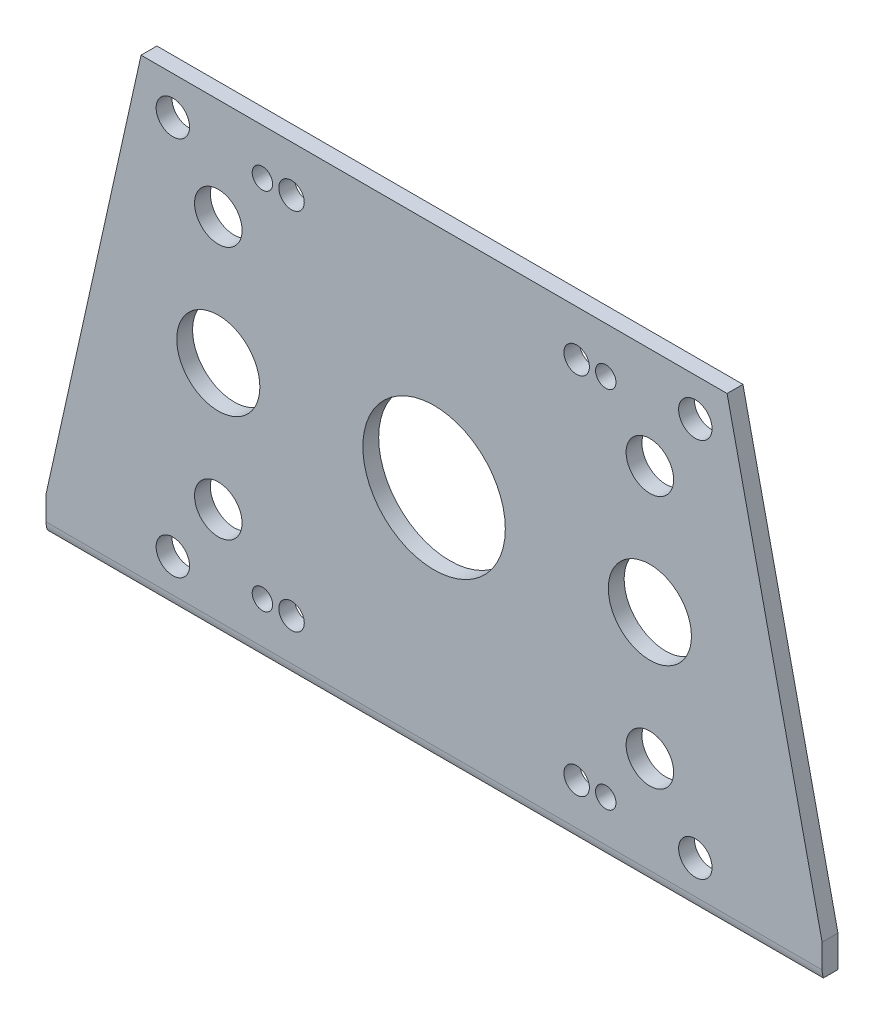
ISO-10303-21;
HEADER;
FILE_DESCRIPTION(('STEP AP214'),'2;1');
FILE_NAME('part.step','',(''),(''),'','','');
FILE_SCHEMA(('AUTOMOTIVE_DESIGN { 1 0 10303 214 1 1 1 1 }'));
ENDSEC;
DATA;
#1=APPLICATION_CONTEXT('core data for automotive mechanical design processes');
#2=APPLICATION_PROTOCOL_DEFINITION('international standard','automotive_design',2000,#1);
#3=PRODUCT_CONTEXT('',#1,'mechanical');
#4=PRODUCT('Part','Part','',(#3));
#5=PRODUCT_RELATED_PRODUCT_CATEGORY('part','',(#4));
#6=PRODUCT_DEFINITION_FORMATION('','',#4);
#7=PRODUCT_DEFINITION_CONTEXT('part definition',#1,'design');
#8=PRODUCT_DEFINITION('design','',#6,#7);
#9=PRODUCT_DEFINITION_SHAPE('','',#8);
#10=(LENGTH_UNIT() NAMED_UNIT(*) SI_UNIT(.MILLI.,.METRE.));
#11=(NAMED_UNIT(*) PLANE_ANGLE_UNIT() SI_UNIT($,.RADIAN.));
#12=(NAMED_UNIT(*) SI_UNIT($,.STERADIAN.) SOLID_ANGLE_UNIT());
#13=UNCERTAINTY_MEASURE_WITH_UNIT(LENGTH_MEASURE(1.E-05),#10,'distance_accuracy_value','');
#14=(GEOMETRIC_REPRESENTATION_CONTEXT(3) GLOBAL_UNCERTAINTY_ASSIGNED_CONTEXT((#13)) GLOBAL_UNIT_ASSIGNED_CONTEXT((#10,
#11,#12)) REPRESENTATION_CONTEXT('',''));
#15=CARTESIAN_POINT('',(0.,0.,0.));
#16=DIRECTION('',(0.,0.,1.));
#17=DIRECTION('',(1.,0.,0.));
#18=AXIS2_PLACEMENT_3D('',#15,#16,#17);
#19=CARTESIAN_POINT('',(-77.7875,46.0375,0.));
#20=DIRECTION('',(0.,0.,-1.));
#21=DIRECTION('',(-1.,0.,0.));
#22=AXIS2_PLACEMENT_3D('',#19,#20,#21);
#23=PLANE('',#22);
#24=CARTESIAN_POINT('',(52.3702628744709,38.4175,0.));
#25=DIRECTION('',(0.,0.,-1.));
#26=DIRECTION('',(-1.,0.,0.));
#27=AXIS2_PLACEMENT_3D('',#24,#25,#26);
#28=CIRCLE('',#27,3.35279999999999);
#29=CARTESIAN_POINT('',(49.0174628744709,38.4175,0.));
#30=VERTEX_POINT('',#29);
#31=EDGE_CURVE('E380',#30,#30,#28,.T.);
#32=ORIENTED_EDGE('',*,*,#31,.F.);
#33=EDGE_LOOP('',(#32));
#34=FACE_BOUND('',#33,.T.);
#35=CARTESIAN_POINT('',(52.3702628744709,-37.7825,0.));
#36=DIRECTION('',(0.,0.,-1.));
#37=DIRECTION('',(-1.,0.,0.));
#38=AXIS2_PLACEMENT_3D('',#35,#36,#37);
#39=CIRCLE('',#38,3.35279999999999);
#40=CARTESIAN_POINT('',(49.0174628744709,-37.7825,0.));
#41=VERTEX_POINT('',#40);
#42=EDGE_CURVE('E374',#41,#41,#39,.T.);
#43=ORIENTED_EDGE('',*,*,#42,.F.);
#44=EDGE_LOOP('',(#43));
#45=FACE_BOUND('',#44,.T.);
#46=CARTESIAN_POINT('',(0.,0.31749999999996,0.));
#47=DIRECTION('',(0.,0.,-1.));
#48=DIRECTION('',(-1.,0.,0.));
#49=AXIS2_PLACEMENT_3D('',#46,#47,#48);
#50=CIRCLE('',#49,14.28115);
#51=CARTESIAN_POINT('',(-14.28115,0.31749999999996,0.));
#52=VERTEX_POINT('',#51);
#53=EDGE_CURVE('E366',#52,#52,#50,.T.);
#54=ORIENTED_EDGE('',*,*,#53,.F.);
#55=EDGE_LOOP('',(#54));
#56=FACE_BOUND('',#55,.T.);
#57=CARTESIAN_POINT('',(34.417,-36.195,0.));
#58=DIRECTION('',(0.,0.,-1.));
#59=DIRECTION('',(-1.,0.,0.));
#60=AXIS2_PLACEMENT_3D('',#57,#58,#59);
#61=CIRCLE('',#60,2.04469999999999);
#62=CARTESIAN_POINT('',(32.3723,-36.195,0.));
#63=VERTEX_POINT('',#62);
#64=EDGE_CURVE('E358',#63,#63,#61,.T.);
#65=ORIENTED_EDGE('',*,*,#64,.F.);
#66=EDGE_LOOP('',(#65));
#67=FACE_BOUND('',#66,.T.);
#68=CARTESIAN_POINT('',(-34.417,36.8299999999999,0.));
#69=DIRECTION('',(0.,0.,-1.));
#70=DIRECTION('',(-1.,0.,0.));
#71=AXIS2_PLACEMENT_3D('',#68,#69,#70);
#72=CIRCLE('',#71,2.04469999999999);
#73=CARTESIAN_POINT('',(-36.4617,36.8299999999999,0.));
#74=VERTEX_POINT('',#73);
#75=EDGE_CURVE('E352',#74,#74,#72,.T.);
#76=ORIENTED_EDGE('',*,*,#75,.F.);
#77=EDGE_LOOP('',(#76));
#78=FACE_BOUND('',#77,.T.);
#79=CARTESIAN_POINT('',(-28.575,-36.195,0.));
#80=DIRECTION('',(0.,0.,-1.));
#81=DIRECTION('',(-1.,0.,0.));
#82=AXIS2_PLACEMENT_3D('',#79,#80,#81);
#83=CIRCLE('',#82,2.55270000000001);
#84=CARTESIAN_POINT('',(-31.1277,-36.195,0.));
#85=VERTEX_POINT('',#84);
#86=EDGE_CURVE('E344',#85,#85,#83,.T.);
#87=ORIENTED_EDGE('',*,*,#86,.F.);
#88=EDGE_LOOP('',(#87));
#89=FACE_BOUND('',#88,.T.);
#90=CARTESIAN_POINT('',(28.575,36.83,0.));
#91=DIRECTION('',(0.,0.,-1.));
#92=DIRECTION('',(-1.,0.,0.));
#93=AXIS2_PLACEMENT_3D('',#90,#91,#92);
#94=CIRCLE('',#93,2.55270000000001);
#95=CARTESIAN_POINT('',(26.0223,36.83,0.));
#96=VERTEX_POINT('',#95);
#97=EDGE_CURVE('E336',#96,#96,#94,.T.);
#98=ORIENTED_EDGE('',*,*,#97,.F.);
#99=EDGE_LOOP('',(#98));
#100=FACE_BOUND('',#99,.T.);
#101=CARTESIAN_POINT('',(43.2562,25.7175,0.));
#102=DIRECTION('',(0.,0.,-1.));
#103=DIRECTION('',(-1.,0.,0.));
#104=AXIS2_PLACEMENT_3D('',#101,#102,#103);
#105=CIRCLE('',#104,4.76249999999999);
#106=CARTESIAN_POINT('',(38.4937,25.7175,0.));
#107=VERTEX_POINT('',#106);
#108=EDGE_CURVE('E328',#107,#107,#105,.T.);
#109=ORIENTED_EDGE('',*,*,#108,.F.);
#110=EDGE_LOOP('',(#109));
#111=FACE_BOUND('',#110,.T.);
#112=CARTESIAN_POINT('',(43.2562,-25.0825,0.));
#113=DIRECTION('',(0.,0.,-1.));
#114=DIRECTION('',(-1.,0.,0.));
#115=AXIS2_PLACEMENT_3D('',#112,#113,#114);
#116=CIRCLE('',#115,4.76249999999999);
#117=CARTESIAN_POINT('',(38.4937,-25.0825,0.));
#118=VERTEX_POINT('',#117);
#119=EDGE_CURVE('E320',#118,#118,#116,.T.);
#120=ORIENTED_EDGE('',*,*,#119,.F.);
#121=EDGE_LOOP('',(#120));
#122=FACE_BOUND('',#121,.T.);
#123=CARTESIAN_POINT('',(-43.2562,25.7175,0.));
#124=DIRECTION('',(0.,0.,-1.));
#125=DIRECTION('',(-1.,0.,0.));
#126=AXIS2_PLACEMENT_3D('',#123,#124,#125);
#127=CIRCLE('',#126,4.76249999999999);
#128=CARTESIAN_POINT('',(-48.0187,25.7175,0.));
#129=VERTEX_POINT('',#128);
#130=EDGE_CURVE('E314',#129,#129,#127,.T.);
#131=ORIENTED_EDGE('',*,*,#130,.F.);
#132=EDGE_LOOP('',(#131));
#133=FACE_BOUND('',#132,.T.);
#134=CARTESIAN_POINT('',(-43.2562,0.317499999999954,0.));
#135=DIRECTION('',(0.,0.,-1.));
#136=DIRECTION('',(-1.,0.,0.));
#137=AXIS2_PLACEMENT_3D('',#134,#135,#136);
#138=CIRCLE('',#137,8.33119999999999);
#139=CARTESIAN_POINT('',(-51.5874,0.317499999999954,0.));
#140=VERTEX_POINT('',#139);
#141=EDGE_CURVE('E308',#140,#140,#138,.T.);
#142=ORIENTED_EDGE('',*,*,#141,.F.);
#143=EDGE_LOOP('',(#142));
#144=FACE_BOUND('',#143,.T.);
#145=CARTESIAN_POINT('',(-43.2562,-25.0825,0.));
#146=DIRECTION('',(0.,0.,-1.));
#147=DIRECTION('',(-1.,0.,0.));
#148=AXIS2_PLACEMENT_3D('',#145,#146,#147);
#149=CIRCLE('',#148,4.76249999999999);
#150=CARTESIAN_POINT('',(-48.0187,-25.0825,0.));
#151=VERTEX_POINT('',#150);
#152=EDGE_CURVE('E302',#151,#151,#149,.T.);
#153=ORIENTED_EDGE('',*,*,#152,.F.);
#154=EDGE_LOOP('',(#153));
#155=FACE_BOUND('',#154,.T.);
#156=CARTESIAN_POINT('',(43.2562,0.317499999999966,0.));
#157=DIRECTION('',(0.,0.,-1.));
#158=DIRECTION('',(-1.,0.,0.));
#159=AXIS2_PLACEMENT_3D('',#156,#157,#158);
#160=CIRCLE('',#159,8.33119999999999);
#161=CARTESIAN_POINT('',(34.925,0.317499999999966,0.));
#162=VERTEX_POINT('',#161);
#163=EDGE_CURVE('E294',#162,#162,#160,.T.);
#164=ORIENTED_EDGE('',*,*,#163,.F.);
#165=EDGE_LOOP('',(#164));
#166=FACE_BOUND('',#165,.T.);
#167=CARTESIAN_POINT('',(-28.575,36.83,0.));
#168=DIRECTION('',(0.,0.,-1.));
#169=DIRECTION('',(-1.,0.,0.));
#170=AXIS2_PLACEMENT_3D('',#167,#168,#169);
#171=CIRCLE('',#170,2.55270000000001);
#172=CARTESIAN_POINT('',(-31.1277,36.83,0.));
#173=VERTEX_POINT('',#172);
#174=EDGE_CURVE('E286',#173,#173,#171,.T.);
#175=ORIENTED_EDGE('',*,*,#174,.F.);
#176=EDGE_LOOP('',(#175));
#177=FACE_BOUND('',#176,.T.);
#178=CARTESIAN_POINT('',(28.575,-36.195,0.));
#179=DIRECTION('',(0.,0.,-1.));
#180=DIRECTION('',(-1.,0.,0.));
#181=AXIS2_PLACEMENT_3D('',#178,#179,#180);
#182=CIRCLE('',#181,2.55270000000001);
#183=CARTESIAN_POINT('',(26.0223,-36.195,0.));
#184=VERTEX_POINT('',#183);
#185=EDGE_CURVE('E278',#184,#184,#182,.T.);
#186=ORIENTED_EDGE('',*,*,#185,.F.);
#187=EDGE_LOOP('',(#186));
#188=FACE_BOUND('',#187,.T.);
#189=CARTESIAN_POINT('',(-34.417,-36.1950000000001,0.));
#190=DIRECTION('',(0.,0.,-1.));
#191=DIRECTION('',(-1.,0.,0.));
#192=AXIS2_PLACEMENT_3D('',#189,#190,#191);
#193=CIRCLE('',#192,2.04469999999999);
#194=CARTESIAN_POINT('',(-36.4617,-36.1950000000001,0.));
#195=VERTEX_POINT('',#194);
#196=EDGE_CURVE('E272',#195,#195,#193,.T.);
#197=ORIENTED_EDGE('',*,*,#196,.F.);
#198=EDGE_LOOP('',(#197));
#199=FACE_BOUND('',#198,.T.);
#200=CARTESIAN_POINT('',(34.417,36.83,0.));
#201=DIRECTION('',(0.,0.,-1.));
#202=DIRECTION('',(-1.,0.,0.));
#203=AXIS2_PLACEMENT_3D('',#200,#201,#202);
#204=CIRCLE('',#203,2.04469999999999);
#205=CARTESIAN_POINT('',(32.3723,36.83,0.));
#206=VERTEX_POINT('',#205);
#207=EDGE_CURVE('E264',#206,#206,#204,.T.);
#208=ORIENTED_EDGE('',*,*,#207,.F.);
#209=EDGE_LOOP('',(#208));
#210=FACE_BOUND('',#209,.T.);
#211=CARTESIAN_POINT('',(-52.3702628744709,38.4175,0.));
#212=DIRECTION('',(0.,0.,-1.));
#213=DIRECTION('',(-1.,0.,0.));
#214=AXIS2_PLACEMENT_3D('',#211,#212,#213);
#215=CIRCLE('',#214,3.35279999999999);
#216=CARTESIAN_POINT('',(-55.7230628744709,38.4175,0.));
#217=VERTEX_POINT('',#216);
#218=EDGE_CURVE('E258',#217,#217,#215,.T.);
#219=ORIENTED_EDGE('',*,*,#218,.F.);
#220=EDGE_LOOP('',(#219));
#221=FACE_BOUND('',#220,.T.);
#222=CARTESIAN_POINT('',(-52.3702628744709,-37.7825,0.));
#223=DIRECTION('',(0.,0.,-1.));
#224=DIRECTION('',(-1.,0.,0.));
#225=AXIS2_PLACEMENT_3D('',#222,#223,#224);
#226=CIRCLE('',#225,3.35279999999999);
#227=CARTESIAN_POINT('',(-55.7230628744709,-37.7825,0.));
#228=VERTEX_POINT('',#227);
#229=EDGE_CURVE('E129',#228,#228,#226,.T.);
#230=ORIENTED_EDGE('',*,*,#229,.F.);
#231=EDGE_LOOP('',(#230));
#232=FACE_BOUND('',#231,.T.);
#233=DIRECTION('',(0.,1.,0.));
#234=VECTOR('',#233,1.);
#235=CARTESIAN_POINT('',(77.7875,46.0375,0.));
#236=LINE('',#235,#234);
#237=CARTESIAN_POINT('',(77.7875,-46.0375,0.));
#238=VERTEX_POINT('',#237);
#239=CARTESIAN_POINT('',(77.7875,-39.6875,0.));
#240=VERTEX_POINT('',#239);
#241=EDGE_CURVE('E113',#238,#240,#236,.T.);
#242=ORIENTED_EDGE('',*,*,#241,.F.);
#243=DIRECTION('',(1.,0.,0.));
#244=VECTOR('',#243,1.);
#245=CARTESIAN_POINT('',(-77.7875,-46.0375,0.));
#246=LINE('',#245,#244);
#247=CARTESIAN_POINT('',(-77.7875,-46.0375,0.));
#248=VERTEX_POINT('',#247);
#249=EDGE_CURVE('E52',#248,#238,#246,.T.);
#250=ORIENTED_EDGE('',*,*,#249,.F.);
#251=DIRECTION('',(0.,1.,0.));
#252=VECTOR('',#251,1.);
#253=CARTESIAN_POINT('',(-77.7875,-46.0375,0.));
#254=LINE('',#253,#252);
#255=CARTESIAN_POINT('',(-77.7875,-39.6875,0.));
#256=VERTEX_POINT('',#255);
#257=EDGE_CURVE('E198',#256,#248,#254,.F.);
#258=ORIENTED_EDGE('',*,*,#257,.F.);
#259=DIRECTION('',(0.216930457818656,0.976187060183953,0.));
#260=VECTOR('',#259,1.);
#261=CARTESIAN_POINT('',(-77.7875,-39.6875,0.));
#262=LINE('',#261,#260);
#263=CARTESIAN_POINT('',(-58.7375,46.0375,0.));
#264=VERTEX_POINT('',#263);
#265=EDGE_CURVE('E157',#256,#264,#262,.T.);
#266=ORIENTED_EDGE('',*,*,#265,.T.);
#267=DIRECTION('',(1.,0.,0.));
#268=VECTOR('',#267,1.);
#269=CARTESIAN_POINT('',(-77.7875,46.0375,0.));
#270=LINE('',#269,#268);
#271=CARTESIAN_POINT('',(58.7375,46.0375,0.));
#272=VERTEX_POINT('',#271);
#273=EDGE_CURVE('E181',#272,#264,#270,.F.);
#274=ORIENTED_EDGE('',*,*,#273,.F.);
#275=DIRECTION('',(-0.216930457818656,0.976187060183953,0.));
#276=VECTOR('',#275,1.);
#277=CARTESIAN_POINT('',(77.7875,-39.6875,0.));
#278=LINE('',#277,#276);
#279=EDGE_CURVE('E119',#240,#272,#278,.T.);
#280=ORIENTED_EDGE('',*,*,#279,.F.);
#281=EDGE_LOOP('',(#242,#250,#258,#266,#274,#280));
#282=FACE_BOUND('',#281,.T.);
#283=ADVANCED_FACE('F45',(#34,#45,#56,#67,#78,#89,#100,#111,#122,#133,#144,#155,#166,#177,#188,
#199,#210,#221,#232,#282),#23,.T.);
#284=CARTESIAN_POINT('',(77.7875,-39.6875,-177.632817516279));
#285=DIRECTION('',(0.976187060183953,0.216930457818656,0.));
#286=DIRECTION('',(-0.216930457818656,0.976187060183953,0.));
#287=AXIS2_PLACEMENT_3D('',#284,#285,#286);
#288=PLANE('',#287);
#289=DIRECTION('',(0.216930457818656,-0.976187060183953,0.));
#290=VECTOR('',#289,1.);
#291=CARTESIAN_POINT('',(59.8424981317448,41.0650084071484,3.175));
#292=LINE('',#291,#290);
#293=CARTESIAN_POINT('',(58.7375,46.0375,3.175));
#294=VERTEX_POINT('',#293);
#295=CARTESIAN_POINT('',(77.7875,-39.6875,3.175));
#296=VERTEX_POINT('',#295);
#297=EDGE_CURVE('E175',#294,#296,#292,.T.);
#298=ORIENTED_EDGE('',*,*,#297,.T.);
#299=DIRECTION('',(0.,0.,-1.));
#300=VECTOR('',#299,1.);
#301=CARTESIAN_POINT('',(77.7875,-39.6875,3.175));
#302=LINE('',#301,#300);
#303=EDGE_CURVE('E122',#240,#296,#302,.F.);
#304=ORIENTED_EDGE('',*,*,#303,.F.);
#305=ORIENTED_EDGE('',*,*,#279,.T.);
#306=DIRECTION('',(0.,0.,-1.));
#307=VECTOR('',#306,1.);
#308=CARTESIAN_POINT('',(58.7375,46.0375,3.175));
#309=LINE('',#308,#307);
#310=EDGE_CURVE('E109',#272,#294,#309,.F.);
#311=ORIENTED_EDGE('',*,*,#310,.T.);
#312=EDGE_LOOP('',(#298,#304,#305,#311));
#313=FACE_BOUND('',#312,.T.);
#314=ADVANCED_FACE('F232',(#313),#288,.T.);
#315=CARTESIAN_POINT('',(77.7875,46.0375,3.175));
#316=DIRECTION('',(1.,0.,0.));
#317=DIRECTION('',(0.,0.,-1.));
#318=AXIS2_PLACEMENT_3D('',#315,#316,#317);
#319=PLANE('',#318);
#320=DIRECTION('',(0.,0.,1.));
#321=VECTOR('',#320,1.);
#322=CARTESIAN_POINT('',(77.7875,-46.0375,-23.926188305154));
#323=LINE('',#322,#321);
#324=CARTESIAN_POINT('',(77.7875,-46.0375,2.921));
#325=VERTEX_POINT('',#324);
#326=EDGE_CURVE('E104',#238,#325,#323,.T.);
#327=ORIENTED_EDGE('',*,*,#326,.F.);
#328=ORIENTED_EDGE('',*,*,#241,.T.);
#329=ORIENTED_EDGE('',*,*,#303,.T.);
#330=DIRECTION('',(0.,1.,0.));
#331=VECTOR('',#330,1.);
#332=CARTESIAN_POINT('',(77.7875,46.0375,3.175));
#333=LINE('',#332,#331);
#334=CARTESIAN_POINT('',(77.7875,-44.5135,3.175));
#335=VERTEX_POINT('',#334);
#336=EDGE_CURVE('E180',#296,#335,#333,.F.);
#337=ORIENTED_EDGE('',*,*,#336,.T.);
#338=CARTESIAN_POINT('',(77.7875,-44.5135,-1.524));
#339=DIRECTION('',(-1.,0.,0.));
#340=DIRECTION('',(0.,0.,1.));
#341=AXIS2_PLACEMENT_3D('',#338,#339,#340);
#342=CIRCLE('',#341,4.699);
#343=EDGE_CURVE('E116',#325,#335,#342,.T.);
#344=ORIENTED_EDGE('',*,*,#343,.F.);
#345=EDGE_LOOP('',(#327,#328,#329,#337,#344));
#346=FACE_BOUND('',#345,.T.);
#347=ADVANCED_FACE('F112',(#346),#319,.T.);
#348=CARTESIAN_POINT('',(-77.7875,-44.5135,-1.524));
#349=DIRECTION('',(-1.,0.,0.));
#350=DIRECTION('',(0.,0.,1.));
#351=AXIS2_PLACEMENT_3D('',#348,#349,#350);
#352=CYLINDRICAL_SURFACE('',#351,4.699);
#353=DIRECTION('',(-1.,0.,0.));
#354=VECTOR('',#353,1.);
#355=CARTESIAN_POINT('',(-77.7875,-46.0375,2.921));
#356=LINE('',#355,#354);
#357=CARTESIAN_POINT('',(-77.7875,-46.0375,2.921));
#358=VERTEX_POINT('',#357);
#359=EDGE_CURVE('E58',#325,#358,#356,.T.);
#360=ORIENTED_EDGE('',*,*,#359,.F.);
#361=ORIENTED_EDGE('',*,*,#343,.T.);
#362=DIRECTION('',(-1.,0.,0.));
#363=VECTOR('',#362,1.);
#364=CARTESIAN_POINT('',(-77.7875,-44.5135,3.175));
#365=LINE('',#364,#363);
#366=CARTESIAN_POINT('',(-77.7875,-44.5135,3.175));
#367=VERTEX_POINT('',#366);
#368=EDGE_CURVE('E388',#335,#367,#365,.T.);
#369=ORIENTED_EDGE('',*,*,#368,.T.);
#370=CARTESIAN_POINT('',(-77.7875,-44.5135,-1.524));
#371=DIRECTION('',(-1.,0.,0.));
#372=DIRECTION('',(0.,0.,1.));
#373=AXIS2_PLACEMENT_3D('',#370,#371,#372);
#374=CIRCLE('',#373,4.699);
#375=EDGE_CURVE('E193',#358,#367,#374,.T.);
#376=ORIENTED_EDGE('',*,*,#375,.F.);
#377=EDGE_LOOP('',(#360,#361,#369,#376));
#378=FACE_BOUND('',#377,.T.);
#379=ADVANCED_FACE('F439',(#378),#352,.T.);
#380=CARTESIAN_POINT('',(-77.7875,-46.0375,3.175));
#381=DIRECTION('',(-1.,0.,0.));
#382=DIRECTION('',(0.,0.,1.));
#383=AXIS2_PLACEMENT_3D('',#380,#381,#382);
#384=PLANE('',#383);
#385=DIRECTION('',(0.,0.,-1.));
#386=VECTOR('',#385,1.);
#387=CARTESIAN_POINT('',(-77.7875,-46.0375,3.175));
#388=LINE('',#387,#386);
#389=EDGE_CURVE('E12',#358,#248,#388,.T.);
#390=ORIENTED_EDGE('',*,*,#389,.F.);
#391=ORIENTED_EDGE('',*,*,#375,.T.);
#392=DIRECTION('',(0.,1.,0.));
#393=VECTOR('',#392,1.);
#394=CARTESIAN_POINT('',(-77.7875,46.0375,3.175));
#395=LINE('',#394,#393);
#396=CARTESIAN_POINT('',(-77.7875,-39.6874999999998,3.175));
#397=VERTEX_POINT('',#396);
#398=EDGE_CURVE('E246',#367,#397,#395,.T.);
#399=ORIENTED_EDGE('',*,*,#398,.T.);
#400=DIRECTION('',(0.,0.,1.));
#401=VECTOR('',#400,1.);
#402=CARTESIAN_POINT('',(-77.7875,-39.6875,-177.632817516279));
#403=LINE('',#402,#401);
#404=EDGE_CURVE('E184',#397,#256,#403,.F.);
#405=ORIENTED_EDGE('',*,*,#404,.T.);
#406=ORIENTED_EDGE('',*,*,#257,.T.);
#407=EDGE_LOOP('',(#390,#391,#399,#405,#406));
#408=FACE_BOUND('',#407,.T.);
#409=ADVANCED_FACE('F427',(#408),#384,.T.);
#410=CARTESIAN_POINT('',(-77.7875,-39.6875,-177.632817516279));
#411=DIRECTION('',(0.976187060183953,-0.216930457818656,0.));
#412=DIRECTION('',(0.216930457818656,0.976187060183953,0.));
#413=AXIS2_PLACEMENT_3D('',#410,#411,#412);
#414=PLANE('',#413);
#415=DIRECTION('',(0.216930457818656,0.976187060183953,0.));
#416=VECTOR('',#415,1.);
#417=CARTESIAN_POINT('',(-77.7875,-39.6875,3.175));
#418=LINE('',#417,#416);
#419=CARTESIAN_POINT('',(-58.7375,46.0375,3.175));
#420=VERTEX_POINT('',#419);
#421=EDGE_CURVE('E173',#397,#420,#418,.T.);
#422=ORIENTED_EDGE('',*,*,#421,.T.);
#423=DIRECTION('',(0.,0.,-1.));
#424=VECTOR('',#423,1.);
#425=CARTESIAN_POINT('',(-58.7375,46.0375,3.175));
#426=LINE('',#425,#424);
#427=EDGE_CURVE('E201',#420,#264,#426,.T.);
#428=ORIENTED_EDGE('',*,*,#427,.T.);
#429=ORIENTED_EDGE('',*,*,#265,.F.);
#430=ORIENTED_EDGE('',*,*,#404,.F.);
#431=EDGE_LOOP('',(#422,#428,#429,#430));
#432=FACE_BOUND('',#431,.T.);
#433=ADVANCED_FACE('F240',(#432),#414,.F.);
#434=CARTESIAN_POINT('',(-77.7875,46.0375,3.175));
#435=DIRECTION('',(0.,1.,0.));
#436=DIRECTION('',(0.,0.,1.));
#437=AXIS2_PLACEMENT_3D('',#434,#435,#436);
#438=PLANE('',#437);
#439=DIRECTION('',(-1.,0.,0.));
#440=VECTOR('',#439,1.);
#441=CARTESIAN_POINT('',(-77.7875,46.0375,3.175));
#442=LINE('',#441,#440);
#443=EDGE_CURVE('E66',#420,#294,#442,.F.);
#444=ORIENTED_EDGE('',*,*,#443,.T.);
#445=ORIENTED_EDGE('',*,*,#310,.F.);
#446=ORIENTED_EDGE('',*,*,#273,.T.);
#447=ORIENTED_EDGE('',*,*,#427,.F.);
#448=EDGE_LOOP('',(#444,#445,#446,#447));
#449=FACE_BOUND('',#448,.T.);
#450=ADVANCED_FACE('F233',(#449),#438,.T.);
#451=CARTESIAN_POINT('',(-77.7875,46.0375,3.175));
#452=DIRECTION('',(0.,0.,-1.));
#453=DIRECTION('',(-1.,0.,0.));
#454=AXIS2_PLACEMENT_3D('',#451,#452,#453);
#455=PLANE('',#454);
#456=CARTESIAN_POINT('',(52.3702628744709,38.4175,3.175));
#457=DIRECTION('',(0.,0.,1.));
#458=DIRECTION('',(1.,0.,0.));
#459=AXIS2_PLACEMENT_3D('',#456,#457,#458);
#460=CIRCLE('',#459,3.35279999999999);
#461=CARTESIAN_POINT('',(55.7230628744709,38.4175,3.175));
#462=VERTEX_POINT('',#461);
#463=EDGE_CURVE('E384',#462,#462,#460,.T.);
#464=ORIENTED_EDGE('',*,*,#463,.F.);
#465=EDGE_LOOP('',(#464));
#466=FACE_BOUND('',#465,.T.);
#467=CARTESIAN_POINT('',(52.3702628744709,-37.7825,3.175));
#468=DIRECTION('',(0.,0.,1.));
#469=DIRECTION('',(1.,0.,0.));
#470=AXIS2_PLACEMENT_3D('',#467,#468,#469);
#471=CIRCLE('',#470,3.35279999999999);
#472=CARTESIAN_POINT('',(55.7230628744709,-37.7825,3.175));
#473=VERTEX_POINT('',#472);
#474=EDGE_CURVE('E377',#473,#473,#471,.T.);
#475=ORIENTED_EDGE('',*,*,#474,.F.);
#476=EDGE_LOOP('',(#475));
#477=FACE_BOUND('',#476,.T.);
#478=CARTESIAN_POINT('',(0.,0.31749999999996,3.175));
#479=DIRECTION('',(0.,0.,1.));
#480=DIRECTION('',(1.,0.,0.));
#481=AXIS2_PLACEMENT_3D('',#478,#479,#480);
#482=CIRCLE('',#481,14.28115);
#483=CARTESIAN_POINT('',(14.28115,0.31749999999996,3.175));
#484=VERTEX_POINT('',#483);
#485=EDGE_CURVE('E370',#484,#484,#482,.T.);
#486=ORIENTED_EDGE('',*,*,#485,.F.);
#487=EDGE_LOOP('',(#486));
#488=FACE_BOUND('',#487,.T.);
#489=CARTESIAN_POINT('',(34.417,-36.195,3.175));
#490=DIRECTION('',(0.,0.,1.));
#491=DIRECTION('',(1.,0.,0.));
#492=AXIS2_PLACEMENT_3D('',#489,#490,#491);
#493=CIRCLE('',#492,2.04469999999999);
#494=CARTESIAN_POINT('',(36.4617,-36.195,3.175));
#495=VERTEX_POINT('',#494);
#496=EDGE_CURVE('E362',#495,#495,#493,.T.);
#497=ORIENTED_EDGE('',*,*,#496,.F.);
#498=EDGE_LOOP('',(#497));
#499=FACE_BOUND('',#498,.T.);
#500=CARTESIAN_POINT('',(-34.417,36.8299999999999,3.175));
#501=DIRECTION('',(0.,0.,1.));
#502=DIRECTION('',(1.,0.,0.));
#503=AXIS2_PLACEMENT_3D('',#500,#501,#502);
#504=CIRCLE('',#503,2.04469999999999);
#505=CARTESIAN_POINT('',(-32.3723,36.8299999999999,3.175));
#506=VERTEX_POINT('',#505);
#507=EDGE_CURVE('E355',#506,#506,#504,.T.);
#508=ORIENTED_EDGE('',*,*,#507,.F.);
#509=EDGE_LOOP('',(#508));
#510=FACE_BOUND('',#509,.T.);
#511=CARTESIAN_POINT('',(-28.575,-36.195,3.175));
#512=DIRECTION('',(0.,0.,1.));
#513=DIRECTION('',(1.,0.,0.));
#514=AXIS2_PLACEMENT_3D('',#511,#512,#513);
#515=CIRCLE('',#514,2.55270000000002);
#516=CARTESIAN_POINT('',(-26.0223,-36.195,3.175));
#517=VERTEX_POINT('',#516);
#518=EDGE_CURVE('E348',#517,#517,#515,.T.);
#519=ORIENTED_EDGE('',*,*,#518,.F.);
#520=EDGE_LOOP('',(#519));
#521=FACE_BOUND('',#520,.T.);
#522=CARTESIAN_POINT('',(28.575,36.83,3.175));
#523=DIRECTION('',(0.,0.,1.));
#524=DIRECTION('',(1.,0.,0.));
#525=AXIS2_PLACEMENT_3D('',#522,#523,#524);
#526=CIRCLE('',#525,2.55270000000002);
#527=CARTESIAN_POINT('',(31.1277,36.83,3.175));
#528=VERTEX_POINT('',#527);
#529=EDGE_CURVE('E340',#528,#528,#526,.T.);
#530=ORIENTED_EDGE('',*,*,#529,.F.);
#531=EDGE_LOOP('',(#530));
#532=FACE_BOUND('',#531,.T.);
#533=CARTESIAN_POINT('',(43.2562,25.7175,3.175));
#534=DIRECTION('',(0.,0.,1.));
#535=DIRECTION('',(1.,0.,0.));
#536=AXIS2_PLACEMENT_3D('',#533,#534,#535);
#537=CIRCLE('',#536,4.76249999999999);
#538=CARTESIAN_POINT('',(48.0187,25.7175,3.175));
#539=VERTEX_POINT('',#538);
#540=EDGE_CURVE('E332',#539,#539,#537,.T.);
#541=ORIENTED_EDGE('',*,*,#540,.F.);
#542=EDGE_LOOP('',(#541));
#543=FACE_BOUND('',#542,.T.);
#544=CARTESIAN_POINT('',(43.2562,-25.0825,3.175));
#545=DIRECTION('',(0.,0.,1.));
#546=DIRECTION('',(1.,0.,0.));
#547=AXIS2_PLACEMENT_3D('',#544,#545,#546);
#548=CIRCLE('',#547,4.76249999999999);
#549=CARTESIAN_POINT('',(48.0187,-25.0825,3.175));
#550=VERTEX_POINT('',#549);
#551=EDGE_CURVE('E324',#550,#550,#548,.T.);
#552=ORIENTED_EDGE('',*,*,#551,.F.);
#553=EDGE_LOOP('',(#552));
#554=FACE_BOUND('',#553,.T.);
#555=CARTESIAN_POINT('',(-43.2562,25.7175,3.175));
#556=DIRECTION('',(0.,0.,1.));
#557=DIRECTION('',(1.,0.,0.));
#558=AXIS2_PLACEMENT_3D('',#555,#556,#557);
#559=CIRCLE('',#558,4.76249999999999);
#560=CARTESIAN_POINT('',(-38.4937,25.7175,3.175));
#561=VERTEX_POINT('',#560);
#562=EDGE_CURVE('E317',#561,#561,#559,.T.);
#563=ORIENTED_EDGE('',*,*,#562,.F.);
#564=EDGE_LOOP('',(#563));
#565=FACE_BOUND('',#564,.T.);
#566=CARTESIAN_POINT('',(-43.2562,0.317499999999954,3.175));
#567=DIRECTION('',(0.,0.,1.));
#568=DIRECTION('',(1.,0.,0.));
#569=AXIS2_PLACEMENT_3D('',#566,#567,#568);
#570=CIRCLE('',#569,8.33119999999999);
#571=CARTESIAN_POINT('',(-34.925,0.317499999999954,3.175));
#572=VERTEX_POINT('',#571);
#573=EDGE_CURVE('E311',#572,#572,#570,.T.);
#574=ORIENTED_EDGE('',*,*,#573,.F.);
#575=EDGE_LOOP('',(#574));
#576=FACE_BOUND('',#575,.T.);
#577=CARTESIAN_POINT('',(-43.2562,-25.0825,3.175));
#578=DIRECTION('',(0.,0.,1.));
#579=DIRECTION('',(1.,0.,0.));
#580=AXIS2_PLACEMENT_3D('',#577,#578,#579);
#581=CIRCLE('',#580,4.76249999999999);
#582=CARTESIAN_POINT('',(-38.4937,-25.0825,3.175));
#583=VERTEX_POINT('',#582);
#584=EDGE_CURVE('E305',#583,#583,#581,.T.);
#585=ORIENTED_EDGE('',*,*,#584,.F.);
#586=EDGE_LOOP('',(#585));
#587=FACE_BOUND('',#586,.T.);
#588=CARTESIAN_POINT('',(43.2562,0.317499999999966,3.175));
#589=DIRECTION('',(0.,0.,1.));
#590=DIRECTION('',(1.,0.,0.));
#591=AXIS2_PLACEMENT_3D('',#588,#589,#590);
#592=CIRCLE('',#591,8.33119999999999);
#593=CARTESIAN_POINT('',(51.5874,0.317499999999966,3.175));
#594=VERTEX_POINT('',#593);
#595=EDGE_CURVE('E298',#594,#594,#592,.T.);
#596=ORIENTED_EDGE('',*,*,#595,.F.);
#597=EDGE_LOOP('',(#596));
#598=FACE_BOUND('',#597,.T.);
#599=CARTESIAN_POINT('',(-28.575,36.83,3.175));
#600=DIRECTION('',(0.,0.,1.));
#601=DIRECTION('',(1.,0.,0.));
#602=AXIS2_PLACEMENT_3D('',#599,#600,#601);
#603=CIRCLE('',#602,2.55270000000002);
#604=CARTESIAN_POINT('',(-26.0223,36.83,3.175));
#605=VERTEX_POINT('',#604);
#606=EDGE_CURVE('E290',#605,#605,#603,.T.);
#607=ORIENTED_EDGE('',*,*,#606,.F.);
#608=EDGE_LOOP('',(#607));
#609=FACE_BOUND('',#608,.T.);
#610=CARTESIAN_POINT('',(28.575,-36.195,3.175));
#611=DIRECTION('',(0.,0.,1.));
#612=DIRECTION('',(1.,0.,0.));
#613=AXIS2_PLACEMENT_3D('',#610,#611,#612);
#614=CIRCLE('',#613,2.55270000000002);
#615=CARTESIAN_POINT('',(31.1277,-36.195,3.175));
#616=VERTEX_POINT('',#615);
#617=EDGE_CURVE('E282',#616,#616,#614,.T.);
#618=ORIENTED_EDGE('',*,*,#617,.F.);
#619=EDGE_LOOP('',(#618));
#620=FACE_BOUND('',#619,.T.);
#621=CARTESIAN_POINT('',(-34.417,-36.1950000000001,3.175));
#622=DIRECTION('',(0.,0.,1.));
#623=DIRECTION('',(1.,0.,0.));
#624=AXIS2_PLACEMENT_3D('',#621,#622,#623);
#625=CIRCLE('',#624,2.04469999999999);
#626=CARTESIAN_POINT('',(-32.3723,-36.1950000000001,3.175));
#627=VERTEX_POINT('',#626);
#628=EDGE_CURVE('E275',#627,#627,#625,.T.);
#629=ORIENTED_EDGE('',*,*,#628,.F.);
#630=EDGE_LOOP('',(#629));
#631=FACE_BOUND('',#630,.T.);
#632=CARTESIAN_POINT('',(34.417,36.83,3.175));
#633=DIRECTION('',(0.,0.,1.));
#634=DIRECTION('',(1.,0.,0.));
#635=AXIS2_PLACEMENT_3D('',#632,#633,#634);
#636=CIRCLE('',#635,2.04469999999999);
#637=CARTESIAN_POINT('',(36.4617,36.83,3.175));
#638=VERTEX_POINT('',#637);
#639=EDGE_CURVE('E268',#638,#638,#636,.T.);
#640=ORIENTED_EDGE('',*,*,#639,.F.);
#641=EDGE_LOOP('',(#640));
#642=FACE_BOUND('',#641,.T.);
#643=CARTESIAN_POINT('',(-52.3702628744709,38.4175,3.175));
#644=DIRECTION('',(0.,0.,1.));
#645=DIRECTION('',(1.,0.,0.));
#646=AXIS2_PLACEMENT_3D('',#643,#644,#645);
#647=CIRCLE('',#646,3.35279999999999);
#648=CARTESIAN_POINT('',(-49.0174628744709,38.4175,3.175));
#649=VERTEX_POINT('',#648);
#650=EDGE_CURVE('E261',#649,#649,#647,.T.);
#651=ORIENTED_EDGE('',*,*,#650,.F.);
#652=EDGE_LOOP('',(#651));
#653=FACE_BOUND('',#652,.T.);
#654=CARTESIAN_POINT('',(-52.3702628744709,-37.7825,3.175));
#655=DIRECTION('',(0.,0.,1.));
#656=DIRECTION('',(1.,0.,0.));
#657=AXIS2_PLACEMENT_3D('',#654,#655,#656);
#658=CIRCLE('',#657,3.35279999999999);
#659=CARTESIAN_POINT('',(-49.0174628744709,-37.7825,3.175));
#660=VERTEX_POINT('',#659);
#661=EDGE_CURVE('E255',#660,#660,#658,.T.);
#662=ORIENTED_EDGE('',*,*,#661,.F.);
#663=EDGE_LOOP('',(#662));
#664=FACE_BOUND('',#663,.T.);
#665=ORIENTED_EDGE('',*,*,#443,.F.);
#666=ORIENTED_EDGE('',*,*,#421,.F.);
#667=ORIENTED_EDGE('',*,*,#398,.F.);
#668=ORIENTED_EDGE('',*,*,#368,.F.);
#669=ORIENTED_EDGE('',*,*,#336,.F.);
#670=ORIENTED_EDGE('',*,*,#297,.F.);
#671=EDGE_LOOP('',(#665,#666,#667,#668,#669,#670));
#672=FACE_BOUND('',#671,.T.);
#673=ADVANCED_FACE('F247',(#466,#477,#488,#499,#510,#521,#532,#543,#554,#565,#576,#587,#598,
#609,#620,#631,#642,#653,#664,#672),#455,.F.);
#674=CARTESIAN_POINT('',(-52.3702628744709,-37.7825,3.175));
#675=DIRECTION('',(0.,0.,1.));
#676=DIRECTION('',(1.,0.,0.));
#677=AXIS2_PLACEMENT_3D('',#674,#675,#676);
#678=CYLINDRICAL_SURFACE('',#677,3.35279999999999);
#679=ORIENTED_EDGE('',*,*,#229,.T.);
#680=EDGE_LOOP('',(#679));
#681=FACE_BOUND('',#680,.T.);
#682=ORIENTED_EDGE('',*,*,#661,.T.);
#683=EDGE_LOOP('',(#682));
#684=FACE_BOUND('',#683,.T.);
#685=ADVANCED_FACE('F403',(#681,#684),#678,.F.);
#686=CARTESIAN_POINT('',(-52.3702628744709,38.4175,3.175));
#687=DIRECTION('',(0.,0.,1.));
#688=DIRECTION('',(1.,0.,0.));
#689=AXIS2_PLACEMENT_3D('',#686,#687,#688);
#690=CYLINDRICAL_SURFACE('',#689,3.35279999999999);
#691=ORIENTED_EDGE('',*,*,#218,.T.);
#692=EDGE_LOOP('',(#691));
#693=FACE_BOUND('',#692,.T.);
#694=ORIENTED_EDGE('',*,*,#650,.T.);
#695=EDGE_LOOP('',(#694));
#696=FACE_BOUND('',#695,.T.);
#697=ADVANCED_FACE('F644',(#693,#696),#690,.F.);
#698=CARTESIAN_POINT('',(34.417,36.83,3.175));
#699=DIRECTION('',(0.,0.,1.));
#700=DIRECTION('',(1.,0.,0.));
#701=AXIS2_PLACEMENT_3D('',#698,#699,#700);
#702=CYLINDRICAL_SURFACE('',#701,2.04469999999999);
#703=ORIENTED_EDGE('',*,*,#207,.T.);
#704=EDGE_LOOP('',(#703));
#705=FACE_BOUND('',#704,.T.);
#706=ORIENTED_EDGE('',*,*,#639,.T.);
#707=EDGE_LOOP('',(#706));
#708=FACE_BOUND('',#707,.T.);
#709=ADVANCED_FACE('F653',(#705,#708),#702,.F.);
#710=CARTESIAN_POINT('',(-34.417,-36.1950000000001,3.175));
#711=DIRECTION('',(0.,0.,1.));
#712=DIRECTION('',(1.,0.,0.));
#713=AXIS2_PLACEMENT_3D('',#710,#711,#712);
#714=CYLINDRICAL_SURFACE('',#713,2.04469999999999);
#715=ORIENTED_EDGE('',*,*,#196,.T.);
#716=EDGE_LOOP('',(#715));
#717=FACE_BOUND('',#716,.T.);
#718=ORIENTED_EDGE('',*,*,#628,.T.);
#719=EDGE_LOOP('',(#718));
#720=FACE_BOUND('',#719,.T.);
#721=ADVANCED_FACE('F662',(#717,#720),#714,.F.);
#722=CARTESIAN_POINT('',(28.575,-36.195,3.175));
#723=DIRECTION('',(0.,0.,1.));
#724=DIRECTION('',(1.,0.,0.));
#725=AXIS2_PLACEMENT_3D('',#722,#723,#724);
#726=CYLINDRICAL_SURFACE('',#725,2.55270000000001);
#727=ORIENTED_EDGE('',*,*,#185,.T.);
#728=EDGE_LOOP('',(#727));
#729=FACE_BOUND('',#728,.T.);
#730=ORIENTED_EDGE('',*,*,#617,.T.);
#731=EDGE_LOOP('',(#730));
#732=FACE_BOUND('',#731,.T.);
#733=ADVANCED_FACE('F671',(#729,#732),#726,.F.);
#734=CARTESIAN_POINT('',(-28.575,36.83,3.175));
#735=DIRECTION('',(0.,0.,1.));
#736=DIRECTION('',(1.,0.,0.));
#737=AXIS2_PLACEMENT_3D('',#734,#735,#736);
#738=CYLINDRICAL_SURFACE('',#737,2.55270000000001);
#739=ORIENTED_EDGE('',*,*,#174,.T.);
#740=EDGE_LOOP('',(#739));
#741=FACE_BOUND('',#740,.T.);
#742=ORIENTED_EDGE('',*,*,#606,.T.);
#743=EDGE_LOOP('',(#742));
#744=FACE_BOUND('',#743,.T.);
#745=ADVANCED_FACE('F680',(#741,#744),#738,.F.);
#746=CARTESIAN_POINT('',(43.2562,0.317499999999966,3.175));
#747=DIRECTION('',(0.,0.,1.));
#748=DIRECTION('',(1.,0.,0.));
#749=AXIS2_PLACEMENT_3D('',#746,#747,#748);
#750=CYLINDRICAL_SURFACE('',#749,8.33119999999999);
#751=ORIENTED_EDGE('',*,*,#163,.T.);
#752=EDGE_LOOP('',(#751));
#753=FACE_BOUND('',#752,.T.);
#754=ORIENTED_EDGE('',*,*,#595,.T.);
#755=EDGE_LOOP('',(#754));
#756=FACE_BOUND('',#755,.T.);
#757=ADVANCED_FACE('F689',(#753,#756),#750,.F.);
#758=CARTESIAN_POINT('',(-43.2562,-25.0825,3.175));
#759=DIRECTION('',(0.,0.,1.));
#760=DIRECTION('',(1.,0.,0.));
#761=AXIS2_PLACEMENT_3D('',#758,#759,#760);
#762=CYLINDRICAL_SURFACE('',#761,4.76249999999999);
#763=ORIENTED_EDGE('',*,*,#152,.T.);
#764=EDGE_LOOP('',(#763));
#765=FACE_BOUND('',#764,.T.);
#766=ORIENTED_EDGE('',*,*,#584,.T.);
#767=EDGE_LOOP('',(#766));
#768=FACE_BOUND('',#767,.T.);
#769=ADVANCED_FACE('F698',(#765,#768),#762,.F.);
#770=CARTESIAN_POINT('',(-43.2562,0.317499999999954,3.175));
#771=DIRECTION('',(0.,0.,1.));
#772=DIRECTION('',(1.,0.,0.));
#773=AXIS2_PLACEMENT_3D('',#770,#771,#772);
#774=CYLINDRICAL_SURFACE('',#773,8.33119999999999);
#775=ORIENTED_EDGE('',*,*,#141,.T.);
#776=EDGE_LOOP('',(#775));
#777=FACE_BOUND('',#776,.T.);
#778=ORIENTED_EDGE('',*,*,#573,.T.);
#779=EDGE_LOOP('',(#778));
#780=FACE_BOUND('',#779,.T.);
#781=ADVANCED_FACE('F707',(#777,#780),#774,.F.);
#782=CARTESIAN_POINT('',(-43.2562,25.7175,3.175));
#783=DIRECTION('',(0.,0.,1.));
#784=DIRECTION('',(1.,0.,0.));
#785=AXIS2_PLACEMENT_3D('',#782,#783,#784);
#786=CYLINDRICAL_SURFACE('',#785,4.76249999999999);
#787=ORIENTED_EDGE('',*,*,#130,.T.);
#788=EDGE_LOOP('',(#787));
#789=FACE_BOUND('',#788,.T.);
#790=ORIENTED_EDGE('',*,*,#562,.T.);
#791=EDGE_LOOP('',(#790));
#792=FACE_BOUND('',#791,.T.);
#793=ADVANCED_FACE('F716',(#789,#792),#786,.F.);
#794=CARTESIAN_POINT('',(43.2562,-25.0825,3.175));
#795=DIRECTION('',(0.,0.,1.));
#796=DIRECTION('',(1.,0.,0.));
#797=AXIS2_PLACEMENT_3D('',#794,#795,#796);
#798=CYLINDRICAL_SURFACE('',#797,4.76249999999999);
#799=ORIENTED_EDGE('',*,*,#119,.T.);
#800=EDGE_LOOP('',(#799));
#801=FACE_BOUND('',#800,.T.);
#802=ORIENTED_EDGE('',*,*,#551,.T.);
#803=EDGE_LOOP('',(#802));
#804=FACE_BOUND('',#803,.T.);
#805=ADVANCED_FACE('F725',(#801,#804),#798,.F.);
#806=CARTESIAN_POINT('',(43.2562,25.7175,3.175));
#807=DIRECTION('',(0.,0.,1.));
#808=DIRECTION('',(1.,0.,0.));
#809=AXIS2_PLACEMENT_3D('',#806,#807,#808);
#810=CYLINDRICAL_SURFACE('',#809,4.76249999999999);
#811=ORIENTED_EDGE('',*,*,#108,.T.);
#812=EDGE_LOOP('',(#811));
#813=FACE_BOUND('',#812,.T.);
#814=ORIENTED_EDGE('',*,*,#540,.T.);
#815=EDGE_LOOP('',(#814));
#816=FACE_BOUND('',#815,.T.);
#817=ADVANCED_FACE('F734',(#813,#816),#810,.F.);
#818=CARTESIAN_POINT('',(28.575,36.83,3.175));
#819=DIRECTION('',(0.,0.,1.));
#820=DIRECTION('',(1.,0.,0.));
#821=AXIS2_PLACEMENT_3D('',#818,#819,#820);
#822=CYLINDRICAL_SURFACE('',#821,2.55270000000001);
#823=ORIENTED_EDGE('',*,*,#97,.T.);
#824=EDGE_LOOP('',(#823));
#825=FACE_BOUND('',#824,.T.);
#826=ORIENTED_EDGE('',*,*,#529,.T.);
#827=EDGE_LOOP('',(#826));
#828=FACE_BOUND('',#827,.T.);
#829=ADVANCED_FACE('F744',(#825,#828),#822,.F.);
#830=CARTESIAN_POINT('',(-28.575,-36.195,3.175));
#831=DIRECTION('',(0.,0.,1.));
#832=DIRECTION('',(1.,0.,0.));
#833=AXIS2_PLACEMENT_3D('',#830,#831,#832);
#834=CYLINDRICAL_SURFACE('',#833,2.55270000000001);
#835=ORIENTED_EDGE('',*,*,#86,.T.);
#836=EDGE_LOOP('',(#835));
#837=FACE_BOUND('',#836,.T.);
#838=ORIENTED_EDGE('',*,*,#518,.T.);
#839=EDGE_LOOP('',(#838));
#840=FACE_BOUND('',#839,.T.);
#841=ADVANCED_FACE('F753',(#837,#840),#834,.F.);
#842=CARTESIAN_POINT('',(-34.417,36.8299999999999,3.175));
#843=DIRECTION('',(0.,0.,1.));
#844=DIRECTION('',(1.,0.,0.));
#845=AXIS2_PLACEMENT_3D('',#842,#843,#844);
#846=CYLINDRICAL_SURFACE('',#845,2.04469999999999);
#847=ORIENTED_EDGE('',*,*,#75,.T.);
#848=EDGE_LOOP('',(#847));
#849=FACE_BOUND('',#848,.T.);
#850=ORIENTED_EDGE('',*,*,#507,.T.);
#851=EDGE_LOOP('',(#850));
#852=FACE_BOUND('',#851,.T.);
#853=ADVANCED_FACE('F762',(#849,#852),#846,.F.);
#854=CARTESIAN_POINT('',(34.417,-36.195,3.175));
#855=DIRECTION('',(0.,0.,1.));
#856=DIRECTION('',(1.,0.,0.));
#857=AXIS2_PLACEMENT_3D('',#854,#855,#856);
#858=CYLINDRICAL_SURFACE('',#857,2.04469999999999);
#859=ORIENTED_EDGE('',*,*,#64,.T.);
#860=EDGE_LOOP('',(#859));
#861=FACE_BOUND('',#860,.T.);
#862=ORIENTED_EDGE('',*,*,#496,.T.);
#863=EDGE_LOOP('',(#862));
#864=FACE_BOUND('',#863,.T.);
#865=ADVANCED_FACE('F771',(#861,#864),#858,.F.);
#866=CARTESIAN_POINT('',(0.,0.31749999999996,3.175));
#867=DIRECTION('',(0.,0.,1.));
#868=DIRECTION('',(1.,0.,0.));
#869=AXIS2_PLACEMENT_3D('',#866,#867,#868);
#870=CYLINDRICAL_SURFACE('',#869,14.28115);
#871=ORIENTED_EDGE('',*,*,#53,.T.);
#872=EDGE_LOOP('',(#871));
#873=FACE_BOUND('',#872,.T.);
#874=ORIENTED_EDGE('',*,*,#485,.T.);
#875=EDGE_LOOP('',(#874));
#876=FACE_BOUND('',#875,.T.);
#877=ADVANCED_FACE('F780',(#873,#876),#870,.F.);
#878=CARTESIAN_POINT('',(52.3702628744709,-37.7825,3.175));
#879=DIRECTION('',(0.,0.,1.));
#880=DIRECTION('',(1.,0.,0.));
#881=AXIS2_PLACEMENT_3D('',#878,#879,#880);
#882=CYLINDRICAL_SURFACE('',#881,3.35279999999999);
#883=ORIENTED_EDGE('',*,*,#42,.T.);
#884=EDGE_LOOP('',(#883));
#885=FACE_BOUND('',#884,.T.);
#886=ORIENTED_EDGE('',*,*,#474,.T.);
#887=EDGE_LOOP('',(#886));
#888=FACE_BOUND('',#887,.T.);
#889=ADVANCED_FACE('F789',(#885,#888),#882,.F.);
#890=CARTESIAN_POINT('',(52.3702628744709,38.4175,3.175));
#891=DIRECTION('',(0.,0.,1.));
#892=DIRECTION('',(1.,0.,0.));
#893=AXIS2_PLACEMENT_3D('',#890,#891,#892);
#894=CYLINDRICAL_SURFACE('',#893,3.35279999999999);
#895=ORIENTED_EDGE('',*,*,#31,.T.);
#896=EDGE_LOOP('',(#895));
#897=FACE_BOUND('',#896,.T.);
#898=ORIENTED_EDGE('',*,*,#463,.T.);
#899=EDGE_LOOP('',(#898));
#900=FACE_BOUND('',#899,.T.);
#901=ADVANCED_FACE('F798',(#897,#900),#894,.F.);
#902=CARTESIAN_POINT('',(-227.0125,-46.0375,-23.926188305154));
#903=DIRECTION('',(0.,1.,0.));
#904=DIRECTION('',(0.,0.,1.));
#905=AXIS2_PLACEMENT_3D('',#902,#903,#904);
#906=PLANE('',#905);
#907=ORIENTED_EDGE('',*,*,#249,.T.);
#908=ORIENTED_EDGE('',*,*,#326,.T.);
#909=ORIENTED_EDGE('',*,*,#359,.T.);
#910=ORIENTED_EDGE('',*,*,#389,.T.);
#911=EDGE_LOOP('',(#907,#908,#909,#910));
#912=FACE_BOUND('',#911,.T.);
#913=ADVANCED_FACE('F103',(#912),#906,.F.);
#914=CLOSED_SHELL('',(#283,#314,#347,#379,#409,#433,#450,#673,#685,#697,#709,#721,#733,#745,
#757,#769,#781,#793,#805,#817,#829,#841,#853,#865,#877,#889,#901,#913));
#915=MANIFOLD_SOLID_BREP('B2',#914);
#916=ADVANCED_BREP_SHAPE_REPRESENTATION('',(#18,#915),#14);
#917=SHAPE_DEFINITION_REPRESENTATION(#9,#916);
ENDSEC;
END-ISO-10303-21;
